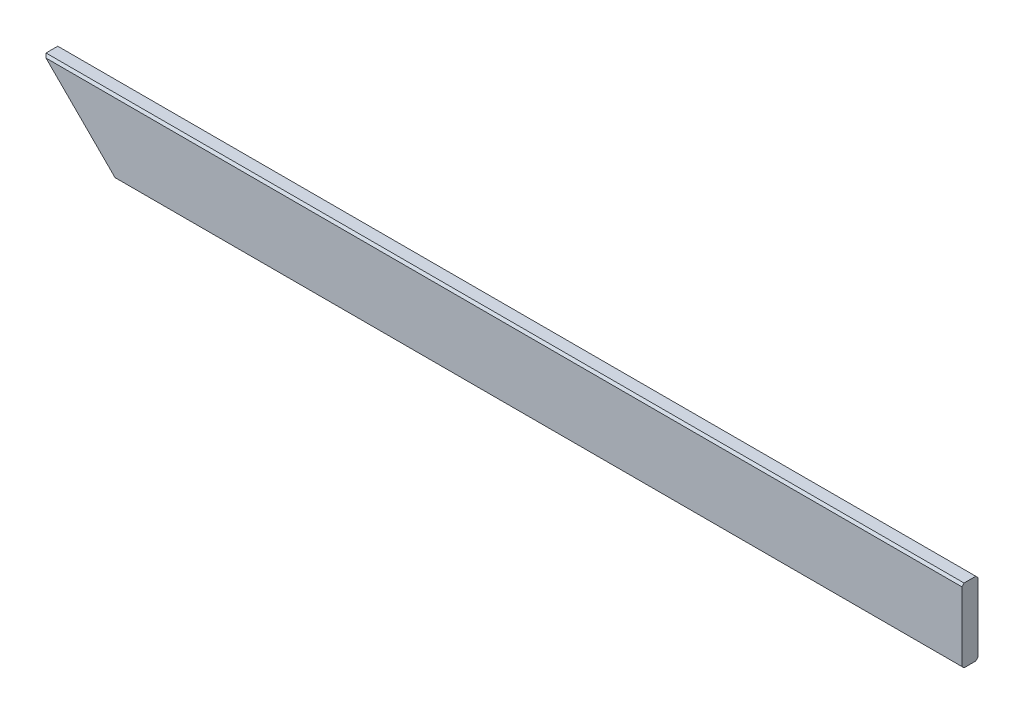
ISO-10303-21;
HEADER;
FILE_DESCRIPTION(('STEP AP214'),'2;1');
FILE_NAME('part.step','',(''),(''),'','','');
FILE_SCHEMA(('AUTOMOTIVE_DESIGN { 1 0 10303 214 1 1 1 1 }'));
ENDSEC;
DATA;
#1=APPLICATION_CONTEXT('core data for automotive mechanical design processes');
#2=APPLICATION_PROTOCOL_DEFINITION('international standard','automotive_design',2000,#1);
#3=PRODUCT_CONTEXT('',#1,'mechanical');
#4=PRODUCT('Part','Part','',(#3));
#5=PRODUCT_RELATED_PRODUCT_CATEGORY('part','',(#4));
#6=PRODUCT_DEFINITION_FORMATION('','',#4);
#7=PRODUCT_DEFINITION_CONTEXT('part definition',#1,'design');
#8=PRODUCT_DEFINITION('design','',#6,#7);
#9=PRODUCT_DEFINITION_SHAPE('','',#8);
#10=(LENGTH_UNIT() NAMED_UNIT(*) SI_UNIT(.MILLI.,.METRE.));
#11=(NAMED_UNIT(*) PLANE_ANGLE_UNIT() SI_UNIT($,.RADIAN.));
#12=(NAMED_UNIT(*) SI_UNIT($,.STERADIAN.) SOLID_ANGLE_UNIT());
#13=UNCERTAINTY_MEASURE_WITH_UNIT(LENGTH_MEASURE(1.E-05),#10,'distance_accuracy_value','');
#14=(GEOMETRIC_REPRESENTATION_CONTEXT(3) GLOBAL_UNCERTAINTY_ASSIGNED_CONTEXT((#13)) GLOBAL_UNIT_ASSIGNED_CONTEXT((#10,
#11,#12)) REPRESENTATION_CONTEXT('',''));
#15=CARTESIAN_POINT('',(0.,0.,0.));
#16=DIRECTION('',(0.,0.,1.));
#17=DIRECTION('',(1.,0.,0.));
#18=AXIS2_PLACEMENT_3D('',#15,#16,#17);
#19=CARTESIAN_POINT('',(0.,0.,22.));
#20=DIRECTION('',(0.,1.,0.));
#21=DIRECTION('',(0.,0.,1.));
#22=AXIS2_PLACEMENT_3D('',#19,#20,#21);
#23=PLANE('',#22);
#24=DIRECTION('',(0.,0.,-1.));
#25=VECTOR('',#24,1.);
#26=CARTESIAN_POINT('',(800.,0.,22.));
#27=LINE('',#26,#25);
#28=CARTESIAN_POINT('',(800.,0.,19.));
#29=VERTEX_POINT('',#28);
#30=CARTESIAN_POINT('',(800.,0.,2.99999999999989));
#31=VERTEX_POINT('',#30);
#32=EDGE_CURVE('E103',#29,#31,#27,.T.);
#33=ORIENTED_EDGE('',*,*,#32,.T.);
#34=DIRECTION('',(1.,0.,0.));
#35=VECTOR('',#34,1.);
#36=CARTESIAN_POINT('',(1950.,0.,2.99999999999989));
#37=LINE('',#36,#35);
#38=CARTESIAN_POINT('',(1950.,0.,2.99999999999989));
#39=VERTEX_POINT('',#38);
#40=EDGE_CURVE('E109',#31,#39,#37,.T.);
#41=ORIENTED_EDGE('',*,*,#40,.T.);
#42=DIRECTION('',(0.,0.,-1.));
#43=VECTOR('',#42,1.);
#44=CARTESIAN_POINT('',(1950.,0.,22.));
#45=LINE('',#44,#43);
#46=CARTESIAN_POINT('',(1950.,0.,19.));
#47=VERTEX_POINT('',#46);
#48=EDGE_CURVE('E106',#47,#39,#45,.T.);
#49=ORIENTED_EDGE('',*,*,#48,.F.);
#50=DIRECTION('',(-1.,0.,0.));
#51=VECTOR('',#50,1.);
#52=CARTESIAN_POINT('',(0.,0.,19.));
#53=LINE('',#52,#51);
#54=EDGE_CURVE('E100',#47,#29,#53,.T.);
#55=ORIENTED_EDGE('',*,*,#54,.T.);
#56=EDGE_LOOP('',(#33,#41,#49,#55));
#57=FACE_BOUND('',#56,.T.);
#58=ADVANCED_FACE('F33',(#57),#23,.F.);
#59=CARTESIAN_POINT('',(1950.,0.,22.));
#60=DIRECTION('',(-1.,0.,0.));
#61=DIRECTION('',(0.,0.,1.));
#62=AXIS2_PLACEMENT_3D('',#59,#60,#61);
#63=PLANE('',#62);
#64=ORIENTED_EDGE('',*,*,#48,.T.);
#65=DIRECTION('',(0.,0.707106781186561,-0.707106781186534));
#66=VECTOR('',#65,1.);
#67=CARTESIAN_POINT('',(1950.,0.,2.99999999999989));
#68=LINE('',#67,#66);
#69=CARTESIAN_POINT('',(1950.,3.,0.));
#70=VERTEX_POINT('',#69);
#71=EDGE_CURVE('E158',#39,#70,#68,.T.);
#72=ORIENTED_EDGE('',*,*,#71,.T.);
#73=DIRECTION('',(0.,1.,0.));
#74=VECTOR('',#73,1.);
#75=CARTESIAN_POINT('',(1950.,0.,0.));
#76=LINE('',#75,#74);
#77=CARTESIAN_POINT('',(1950.,97.,0.));
#78=VERTEX_POINT('',#77);
#79=EDGE_CURVE('E118',#70,#78,#76,.T.);
#80=ORIENTED_EDGE('',*,*,#79,.T.);
#81=DIRECTION('',(0.,0.707106781186561,0.707106781186534));
#82=VECTOR('',#81,1.);
#83=CARTESIAN_POINT('',(1950.,100.,2.99999999999989));
#84=LINE('',#83,#82);
#85=CARTESIAN_POINT('',(1950.,100.,2.99999999999989));
#86=VERTEX_POINT('',#85);
#87=EDGE_CURVE('E148',#78,#86,#84,.T.);
#88=ORIENTED_EDGE('',*,*,#87,.T.);
#89=DIRECTION('',(0.,0.,-1.));
#90=VECTOR('',#89,1.);
#91=CARTESIAN_POINT('',(1950.,100.,22.));
#92=LINE('',#91,#90);
#93=CARTESIAN_POINT('',(1950.,100.,19.));
#94=VERTEX_POINT('',#93);
#95=EDGE_CURVE('E138',#94,#86,#92,.T.);
#96=ORIENTED_EDGE('',*,*,#95,.F.);
#97=DIRECTION('',(0.,0.707106781186534,-0.707106781186561));
#98=VECTOR('',#97,1.);
#99=CARTESIAN_POINT('',(1950.,97.0000000000001,22.));
#100=LINE('',#99,#98);
#101=CARTESIAN_POINT('',(1950.,97.0000000000001,22.));
#102=VERTEX_POINT('',#101);
#103=EDGE_CURVE('E144',#94,#102,#100,.F.);
#104=ORIENTED_EDGE('',*,*,#103,.T.);
#105=DIRECTION('',(0.,1.,0.));
#106=VECTOR('',#105,1.);
#107=CARTESIAN_POINT('',(1950.,0.,22.));
#108=LINE('',#107,#106);
#109=CARTESIAN_POINT('',(1950.,2.99999999999989,22.));
#110=VERTEX_POINT('',#109);
#111=EDGE_CURVE('E149',#110,#102,#108,.T.);
#112=ORIENTED_EDGE('',*,*,#111,.F.);
#113=DIRECTION('',(0.,0.707106781186534,0.707106781186561));
#114=VECTOR('',#113,1.);
#115=CARTESIAN_POINT('',(1950.,2.99999999999989,22.));
#116=LINE('',#115,#114);
#117=EDGE_CURVE('E153',#110,#47,#116,.F.);
#118=ORIENTED_EDGE('',*,*,#117,.T.);
#119=EDGE_LOOP('',(#64,#72,#80,#88,#96,#104,#112,#118));
#120=FACE_BOUND('',#119,.T.);
#121=ADVANCED_FACE('F142',(#120),#63,.F.);
#122=CARTESIAN_POINT('',(0.,100.,22.));
#123=DIRECTION('',(0.,-1.,0.));
#124=DIRECTION('',(0.,0.,-1.));
#125=AXIS2_PLACEMENT_3D('',#122,#123,#124);
#126=PLANE('',#125);
#127=ORIENTED_EDGE('',*,*,#95,.T.);
#128=DIRECTION('',(-1.,0.,0.));
#129=VECTOR('',#128,1.);
#130=CARTESIAN_POINT('',(699.999999999999,100.,2.99999999999989));
#131=LINE('',#130,#129);
#132=CARTESIAN_POINT('',(699.999999999999,100.,2.99999999999989));
#133=VERTEX_POINT('',#132);
#134=EDGE_CURVE('E11',#86,#133,#131,.T.);
#135=ORIENTED_EDGE('',*,*,#134,.T.);
#136=DIRECTION('',(0.,0.,-1.));
#137=VECTOR('',#136,1.);
#138=CARTESIAN_POINT('',(699.999999999999,100.,22.));
#139=LINE('',#138,#137);
#140=CARTESIAN_POINT('',(699.999999999999,100.,19.));
#141=VERTEX_POINT('',#140);
#142=EDGE_CURVE('E119',#141,#133,#139,.T.);
#143=ORIENTED_EDGE('',*,*,#142,.F.);
#144=DIRECTION('',(1.,0.,0.));
#145=VECTOR('',#144,1.);
#146=CARTESIAN_POINT('',(0.,100.,19.));
#147=LINE('',#146,#145);
#148=EDGE_CURVE('E41',#141,#94,#147,.T.);
#149=ORIENTED_EDGE('',*,*,#148,.T.);
#150=EDGE_LOOP('',(#127,#135,#143,#149));
#151=FACE_BOUND('',#150,.T.);
#152=ADVANCED_FACE('F137',(#151),#126,.F.);
#153=CARTESIAN_POINT('',(0.,0.,22.));
#154=DIRECTION('',(0.,0.,-1.));
#155=DIRECTION('',(-1.,0.,0.));
#156=AXIS2_PLACEMENT_3D('',#153,#154,#155);
#157=PLANE('',#156);
#158=DIRECTION('',(0.707106781186551,-0.707106781186544,0.));
#159=VECTOR('',#158,1.);
#160=CARTESIAN_POINT('',(800.,0.,22.));
#161=LINE('',#160,#159);
#162=CARTESIAN_POINT('',(702.999999999999,97.0000000000001,22.));
#163=VERTEX_POINT('',#162);
#164=CARTESIAN_POINT('',(797.,2.99999999999988,22.));
#165=VERTEX_POINT('',#164);
#166=EDGE_CURVE('E175',#163,#165,#161,.T.);
#167=ORIENTED_EDGE('',*,*,#166,.T.);
#168=DIRECTION('',(1.,0.,0.));
#169=VECTOR('',#168,1.);
#170=CARTESIAN_POINT('',(0.,2.99999999999989,22.));
#171=LINE('',#170,#169);
#172=EDGE_CURVE('E124',#165,#110,#171,.T.);
#173=ORIENTED_EDGE('',*,*,#172,.T.);
#174=ORIENTED_EDGE('',*,*,#111,.T.);
#175=DIRECTION('',(-1.,0.,0.));
#176=VECTOR('',#175,1.);
#177=CARTESIAN_POINT('',(0.,97.0000000000001,22.));
#178=LINE('',#177,#176);
#179=EDGE_CURVE('E126',#102,#163,#178,.T.);
#180=ORIENTED_EDGE('',*,*,#179,.T.);
#181=EDGE_LOOP('',(#167,#173,#174,#180));
#182=FACE_BOUND('',#181,.T.);
#183=ADVANCED_FACE('F178',(#182),#157,.F.);
#184=CARTESIAN_POINT('',(0.,0.,0.));
#185=DIRECTION('',(0.,0.,-1.));
#186=DIRECTION('',(-1.,0.,0.));
#187=AXIS2_PLACEMENT_3D('',#184,#185,#186);
#188=PLANE('',#187);
#189=ORIENTED_EDGE('',*,*,#79,.F.);
#190=DIRECTION('',(-1.,0.,0.));
#191=VECTOR('',#190,1.);
#192=CARTESIAN_POINT('',(800.,3.,0.));
#193=LINE('',#192,#191);
#194=CARTESIAN_POINT('',(797.,3.00000000000006,0.));
#195=VERTEX_POINT('',#194);
#196=EDGE_CURVE('E162',#70,#195,#193,.T.);
#197=ORIENTED_EDGE('',*,*,#196,.T.);
#198=DIRECTION('',(0.707106781186551,-0.707106781186544,0.));
#199=VECTOR('',#198,1.);
#200=CARTESIAN_POINT('',(399.999999999996,400.,0.));
#201=LINE('',#200,#199);
#202=CARTESIAN_POINT('',(702.999999999999,97.,0.));
#203=VERTEX_POINT('',#202);
#204=EDGE_CURVE('E110',#203,#195,#201,.T.);
#205=ORIENTED_EDGE('',*,*,#204,.F.);
#206=DIRECTION('',(1.,0.,0.));
#207=VECTOR('',#206,1.);
#208=CARTESIAN_POINT('',(1950.,97.,0.));
#209=LINE('',#208,#207);
#210=EDGE_CURVE('E160',#203,#78,#209,.T.);
#211=ORIENTED_EDGE('',*,*,#210,.T.);
#212=EDGE_LOOP('',(#189,#197,#205,#211));
#213=FACE_BOUND('',#212,.T.);
#214=ADVANCED_FACE('F167',(#213),#188,.T.);
#215=CARTESIAN_POINT('',(800.,0.,22.));
#216=DIRECTION('',(0.707106781186544,0.707106781186551,0.));
#217=DIRECTION('',(-0.707106781186551,0.707106781186544,0.));
#218=AXIS2_PLACEMENT_3D('',#215,#216,#217);
#219=PLANE('',#218);
#220=ORIENTED_EDGE('',*,*,#204,.T.);
#221=DIRECTION('',(0.577350269189636,-0.577350269189631,0.57735026918961));
#222=VECTOR('',#221,1.);
#223=CARTESIAN_POINT('',(533.333333333323,266.666666666674,-263.666666666664));
#224=LINE('',#223,#222);
#225=EDGE_CURVE('E117',#195,#31,#224,.T.);
#226=ORIENTED_EDGE('',*,*,#225,.T.);
#227=ORIENTED_EDGE('',*,*,#32,.F.);
#228=DIRECTION('',(0.577350269189622,-0.577350269189617,-0.577350269189638));
#229=VECTOR('',#228,1.);
#230=CARTESIAN_POINT('',(531.333333333337,268.666666666661,287.666666666671));
#231=LINE('',#230,#229);
#232=EDGE_CURVE('E114',#29,#165,#231,.F.);
#233=ORIENTED_EDGE('',*,*,#232,.T.);
#234=ORIENTED_EDGE('',*,*,#166,.F.);
#235=DIRECTION('',(0.577350269189622,-0.577350269189617,0.577350269189638));
#236=VECTOR('',#235,1.);
#237=CARTESIAN_POINT('',(468.666666666669,331.333333333328,-212.333333333337));
#238=LINE('',#237,#236);
#239=EDGE_CURVE('E55',#163,#141,#238,.F.);
#240=ORIENTED_EDGE('',*,*,#239,.T.);
#241=ORIENTED_EDGE('',*,*,#142,.T.);
#242=DIRECTION('',(0.577350269189636,-0.577350269189631,-0.57735026918961));
#243=VECTOR('',#242,1.);
#244=CARTESIAN_POINT('',(466.666666666657,333.333333333339,236.333333333331));
#245=LINE('',#244,#243);
#246=EDGE_CURVE('E48',#133,#203,#245,.T.);
#247=ORIENTED_EDGE('',*,*,#246,.T.);
#248=EDGE_LOOP('',(#220,#226,#227,#233,#234,#240,#241,#247));
#249=FACE_BOUND('',#248,.T.);
#250=ADVANCED_FACE('F113',(#249),#219,.F.);
#251=CARTESIAN_POINT('',(0.,0.,2.99999999999989));
#252=DIRECTION('',(0.,-0.707106781186534,-0.707106781186561));
#253=DIRECTION('',(-1.,0.,0.));
#254=AXIS2_PLACEMENT_3D('',#251,#252,#253);
#255=PLANE('',#254);
#256=ORIENTED_EDGE('',*,*,#225,.F.);
#257=ORIENTED_EDGE('',*,*,#196,.F.);
#258=ORIENTED_EDGE('',*,*,#71,.F.);
#259=ORIENTED_EDGE('',*,*,#40,.F.);
#260=EDGE_LOOP('',(#256,#257,#258,#259));
#261=FACE_BOUND('',#260,.T.);
#262=ADVANCED_FACE('F170',(#261),#255,.T.);
#263=CARTESIAN_POINT('',(0.,2.99999999999989,22.));
#264=DIRECTION('',(0.,0.707106781186561,-0.707106781186534));
#265=DIRECTION('',(1.,0.,0.));
#266=AXIS2_PLACEMENT_3D('',#263,#264,#265);
#267=PLANE('',#266);
#268=ORIENTED_EDGE('',*,*,#232,.F.);
#269=ORIENTED_EDGE('',*,*,#54,.F.);
#270=ORIENTED_EDGE('',*,*,#117,.F.);
#271=ORIENTED_EDGE('',*,*,#172,.F.);
#272=EDGE_LOOP('',(#268,#269,#270,#271));
#273=FACE_BOUND('',#272,.T.);
#274=ADVANCED_FACE('F122',(#273),#267,.F.);
#275=CARTESIAN_POINT('',(0.,100.,2.99999999999989));
#276=DIRECTION('',(0.,0.707106781186534,-0.707106781186561));
#277=DIRECTION('',(1.,0.,0.));
#278=AXIS2_PLACEMENT_3D('',#275,#276,#277);
#279=PLANE('',#278);
#280=ORIENTED_EDGE('',*,*,#87,.F.);
#281=ORIENTED_EDGE('',*,*,#210,.F.);
#282=ORIENTED_EDGE('',*,*,#246,.F.);
#283=ORIENTED_EDGE('',*,*,#134,.F.);
#284=EDGE_LOOP('',(#280,#281,#282,#283));
#285=FACE_BOUND('',#284,.T.);
#286=ADVANCED_FACE('F198',(#285),#279,.T.);
#287=CARTESIAN_POINT('',(0.,97.0000000000001,22.));
#288=DIRECTION('',(0.,-0.707106781186561,-0.707106781186534));
#289=DIRECTION('',(-1.,0.,0.));
#290=AXIS2_PLACEMENT_3D('',#287,#288,#289);
#291=PLANE('',#290);
#292=ORIENTED_EDGE('',*,*,#103,.F.);
#293=ORIENTED_EDGE('',*,*,#148,.F.);
#294=ORIENTED_EDGE('',*,*,#239,.F.);
#295=ORIENTED_EDGE('',*,*,#179,.F.);
#296=EDGE_LOOP('',(#292,#293,#294,#295));
#297=FACE_BOUND('',#296,.T.);
#298=ADVANCED_FACE('F35',(#297),#291,.F.);
#299=CLOSED_SHELL('',(#58,#121,#152,#183,#214,#250,#262,#274,#286,#298));
#300=MANIFOLD_SOLID_BREP('B2',#299);
#301=ADVANCED_BREP_SHAPE_REPRESENTATION('',(#18,#300),#14);
#302=SHAPE_DEFINITION_REPRESENTATION(#9,#301);
ENDSEC;
END-ISO-10303-21;
